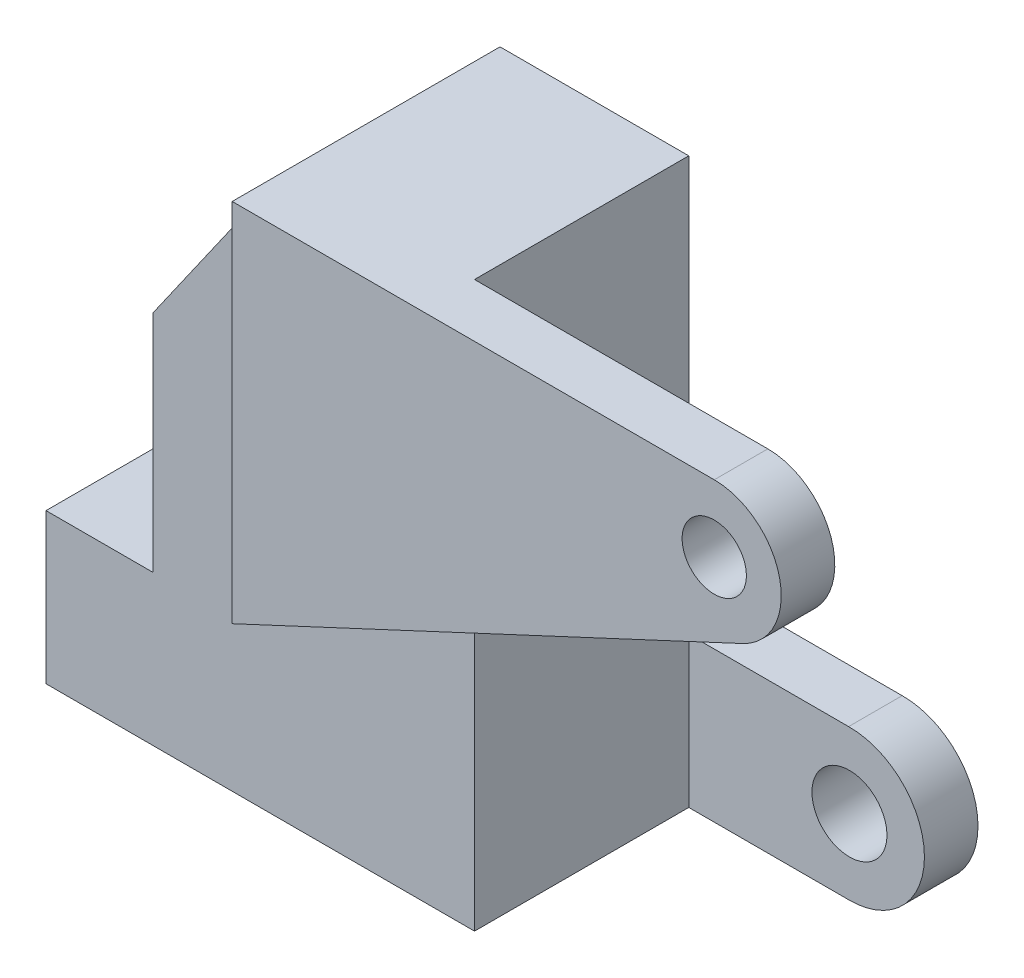
ISO-10303-21;
HEADER;
FILE_DESCRIPTION(('STEP AP214'),'2;1');
FILE_NAME('part.step','',(''),(''),'','','');
FILE_SCHEMA(('AUTOMOTIVE_DESIGN { 1 0 10303 214 1 1 1 1 }'));
ENDSEC;
DATA;
#1=APPLICATION_CONTEXT('core data for automotive mechanical design processes');
#2=APPLICATION_PROTOCOL_DEFINITION('international standard','automotive_design',2000,#1);
#3=PRODUCT_CONTEXT('',#1,'mechanical');
#4=PRODUCT('Part','Part','',(#3));
#5=PRODUCT_RELATED_PRODUCT_CATEGORY('part','',(#4));
#6=PRODUCT_DEFINITION_FORMATION('','',#4);
#7=PRODUCT_DEFINITION_CONTEXT('part definition',#1,'design');
#8=PRODUCT_DEFINITION('design','',#6,#7);
#9=PRODUCT_DEFINITION_SHAPE('','',#8);
#10=(LENGTH_UNIT() NAMED_UNIT(*) SI_UNIT(.MILLI.,.METRE.));
#11=(NAMED_UNIT(*) PLANE_ANGLE_UNIT() SI_UNIT($,.RADIAN.));
#12=(NAMED_UNIT(*) SI_UNIT($,.STERADIAN.) SOLID_ANGLE_UNIT());
#13=UNCERTAINTY_MEASURE_WITH_UNIT(LENGTH_MEASURE(1.E-05),#10,'distance_accuracy_value','');
#14=(GEOMETRIC_REPRESENTATION_CONTEXT(3) GLOBAL_UNCERTAINTY_ASSIGNED_CONTEXT((#13)) GLOBAL_UNIT_ASSIGNED_CONTEXT((#10,
#11,#12)) REPRESENTATION_CONTEXT('',''));
#15=CARTESIAN_POINT('',(0.,0.,0.));
#16=DIRECTION('',(0.,0.,1.));
#17=DIRECTION('',(1.,0.,0.));
#18=AXIS2_PLACEMENT_3D('',#15,#16,#17);
#19=CARTESIAN_POINT('',(0.,0.,0.));
#20=DIRECTION('',(0.,0.,1.));
#21=DIRECTION('',(1.,0.,0.));
#22=AXIS2_PLACEMENT_3D('',#19,#20,#21);
#23=PLANE('',#22);
#24=DIRECTION('',(1.,0.,0.));
#25=VECTOR('',#24,1.);
#26=CARTESIAN_POINT('',(54.9222940345143,14.,0.));
#27=LINE('',#26,#25);
#28=CARTESIAN_POINT('',(10.,14.,0.));
#29=VERTEX_POINT('',#28);
#30=CARTESIAN_POINT('',(40.,14.,0.));
#31=VERTEX_POINT('',#30);
#32=EDGE_CURVE('E218',#29,#31,#27,.T.);
#33=ORIENTED_EDGE('',*,*,#32,.F.);
#34=DIRECTION('',(0.,-1.,0.));
#35=VECTOR('',#34,1.);
#36=CARTESIAN_POINT('',(10.,35.,0.));
#37=LINE('',#36,#35);
#38=CARTESIAN_POINT('',(10.,35.,0.));
#39=VERTEX_POINT('',#38);
#40=EDGE_CURVE('E285',#39,#29,#37,.T.);
#41=ORIENTED_EDGE('',*,*,#40,.F.);
#42=DIRECTION('',(-0.573576436351047,-0.819152044288991,0.));
#43=VECTOR('',#42,1.);
#44=CARTESIAN_POINT('',(22.3806500179262,52.681400645273,0.));
#45=LINE('',#44,#43);
#46=CARTESIAN_POINT('',(22.3806500179262,52.681400645273,0.));
#47=VERTEX_POINT('',#46);
#48=EDGE_CURVE('E282',#47,#39,#45,.T.);
#49=ORIENTED_EDGE('',*,*,#48,.F.);
#50=DIRECTION('',(-1.,0.,0.));
#51=VECTOR('',#50,1.);
#52=CARTESIAN_POINT('',(40.,52.681400645273,0.));
#53=LINE('',#52,#51);
#54=CARTESIAN_POINT('',(40.,52.681400645273,0.));
#55=VERTEX_POINT('',#54);
#56=EDGE_CURVE('E278',#55,#47,#53,.T.);
#57=ORIENTED_EDGE('',*,*,#56,.F.);
#58=DIRECTION('',(0.,1.,0.));
#59=VECTOR('',#58,1.);
#60=CARTESIAN_POINT('',(40.,0.,0.));
#61=LINE('',#60,#59);
#62=EDGE_CURVE('E69',#31,#55,#61,.T.);
#63=ORIENTED_EDGE('',*,*,#62,.F.);
#64=EDGE_LOOP('',(#33,#41,#49,#57,#63));
#65=FACE_BOUND('',#64,.T.);
#66=ADVANCED_FACE('F43',(#65),#23,.F.);
#67=DIRECTION('',(0.,1.,0.));
#68=VECTOR('',#67,1.);
#69=CARTESIAN_POINT('',(10.,0.,0.));
#70=LINE('',#69,#68);
#71=CARTESIAN_POINT('',(10.,0.,0.));
#72=VERTEX_POINT('',#71);
#73=EDGE_CURVE('E208',#72,#29,#70,.T.);
#74=ORIENTED_EDGE('',*,*,#73,.F.);
#75=DIRECTION('',(1.,0.,0.));
#76=VECTOR('',#75,1.);
#77=CARTESIAN_POINT('',(0.,0.,0.));
#78=LINE('',#77,#76);
#79=CARTESIAN_POINT('',(0.,0.,0.));
#80=VERTEX_POINT('',#79);
#81=EDGE_CURVE('E271',#80,#72,#78,.T.);
#82=ORIENTED_EDGE('',*,*,#81,.F.);
#83=DIRECTION('',(0.,-1.,0.));
#84=VECTOR('',#83,1.);
#85=CARTESIAN_POINT('',(0.,14.,0.));
#86=LINE('',#85,#84);
#87=CARTESIAN_POINT('',(0.,14.,0.));
#88=VERTEX_POINT('',#87);
#89=EDGE_CURVE('E245',#88,#80,#86,.T.);
#90=ORIENTED_EDGE('',*,*,#89,.F.);
#91=DIRECTION('',(-1.,0.,0.));
#92=VECTOR('',#91,1.);
#93=CARTESIAN_POINT('',(10.,14.,0.));
#94=LINE('',#93,#92);
#95=EDGE_CURVE('E251',#29,#88,#94,.T.);
#96=ORIENTED_EDGE('',*,*,#95,.F.);
#97=EDGE_LOOP('',(#74,#82,#90,#96));
#98=FACE_BOUND('',#97,.T.);
#99=ADVANCED_FACE('F325',(#98),#23,.F.);
#100=DIRECTION('',(-0.999999999815628,-1.92026949065218E-05,0.));
#101=VECTOR('',#100,1.);
#102=CARTESIAN_POINT('',(54.9222940262319,0.00086262910684584,0.));
#103=LINE('',#102,#101);
#104=CARTESIAN_POINT('',(40.,0.000576080847301866,0.));
#105=VERTEX_POINT('',#104);
#106=EDGE_CURVE('E11',#105,#72,#103,.T.);
#107=ORIENTED_EDGE('',*,*,#106,.F.);
#108=CARTESIAN_POINT('',(40.,0.,0.));
#109=VERTEX_POINT('',#108);
#110=EDGE_CURVE('E274',#109,#105,#61,.T.);
#111=ORIENTED_EDGE('',*,*,#110,.F.);
#112=EDGE_CURVE('E270',#72,#109,#78,.T.);
#113=ORIENTED_EDGE('',*,*,#112,.F.);
#114=EDGE_LOOP('',(#107,#111,#113));
#115=FACE_BOUND('',#114,.T.);
#116=ADVANCED_FACE('F424',(#115),#23,.F.);
#117=CARTESIAN_POINT('',(0.,14.,20.));
#118=DIRECTION('',(1.,0.,0.));
#119=DIRECTION('',(0.,1.,0.));
#120=AXIS2_PLACEMENT_3D('',#117,#118,#119);
#121=PLANE('',#120);
#122=ORIENTED_EDGE('',*,*,#89,.T.);
#123=DIRECTION('',(0.,0.,-1.));
#124=VECTOR('',#123,1.);
#125=CARTESIAN_POINT('',(0.,0.,20.));
#126=LINE('',#125,#124);
#127=CARTESIAN_POINT('',(0.,0.,20.));
#128=VERTEX_POINT('',#127);
#129=EDGE_CURVE('E47',#128,#80,#126,.T.);
#130=ORIENTED_EDGE('',*,*,#129,.F.);
#131=DIRECTION('',(0.,-1.,0.));
#132=VECTOR('',#131,1.);
#133=CARTESIAN_POINT('',(0.,14.,20.));
#134=LINE('',#133,#132);
#135=CARTESIAN_POINT('',(0.,14.,20.));
#136=VERTEX_POINT('',#135);
#137=EDGE_CURVE('E246',#136,#128,#134,.T.);
#138=ORIENTED_EDGE('',*,*,#137,.F.);
#139=DIRECTION('',(0.,0.,-1.));
#140=VECTOR('',#139,1.);
#141=CARTESIAN_POINT('',(0.,14.,20.));
#142=LINE('',#141,#140);
#143=EDGE_CURVE('E266',#136,#88,#142,.T.);
#144=ORIENTED_EDGE('',*,*,#143,.T.);
#145=EDGE_LOOP('',(#122,#130,#138,#144));
#146=FACE_BOUND('',#145,.T.);
#147=ADVANCED_FACE('F45',(#146),#121,.F.);
#148=CARTESIAN_POINT('',(0.,0.,20.));
#149=DIRECTION('',(0.,1.,0.));
#150=DIRECTION('',(0.,0.,1.));
#151=AXIS2_PLACEMENT_3D('',#148,#149,#150);
#152=PLANE('',#151);
#153=ORIENTED_EDGE('',*,*,#81,.T.);
#154=ORIENTED_EDGE('',*,*,#112,.T.);
#155=DIRECTION('',(0.,0.,-1.));
#156=VECTOR('',#155,1.);
#157=CARTESIAN_POINT('',(40.,0.,20.));
#158=LINE('',#157,#156);
#159=CARTESIAN_POINT('',(40.,0.,20.));
#160=VERTEX_POINT('',#159);
#161=EDGE_CURVE('E307',#160,#109,#158,.T.);
#162=ORIENTED_EDGE('',*,*,#161,.F.);
#163=DIRECTION('',(1.,0.,0.));
#164=VECTOR('',#163,1.);
#165=CARTESIAN_POINT('',(0.,0.,20.));
#166=LINE('',#165,#164);
#167=EDGE_CURVE('E250',#128,#160,#166,.T.);
#168=ORIENTED_EDGE('',*,*,#167,.F.);
#169=ORIENTED_EDGE('',*,*,#129,.T.);
#170=EDGE_LOOP('',(#153,#154,#162,#168,#169));
#171=FACE_BOUND('',#170,.T.);
#172=ADVANCED_FACE('F316',(#171),#152,.F.);
#173=CARTESIAN_POINT('',(40.,0.,20.));
#174=DIRECTION('',(-1.,0.,0.));
#175=DIRECTION('',(0.,0.,1.));
#176=AXIS2_PLACEMENT_3D('',#173,#174,#175);
#177=PLANE('',#176);
#178=ORIENTED_EDGE('',*,*,#110,.T.);
#179=EDGE_CURVE('E279',#105,#31,#61,.T.);
#180=ORIENTED_EDGE('',*,*,#179,.T.);
#181=ORIENTED_EDGE('',*,*,#62,.T.);
#182=DIRECTION('',(0.,0.,-1.));
#183=VECTOR('',#182,1.);
#184=CARTESIAN_POINT('',(40.,52.681400645273,20.));
#185=LINE('',#184,#183);
#186=CARTESIAN_POINT('',(40.,52.681400645273,20.));
#187=VERTEX_POINT('',#186);
#188=EDGE_CURVE('E304',#187,#55,#185,.T.);
#189=ORIENTED_EDGE('',*,*,#188,.F.);
#190=DIRECTION('',(0.,1.,0.));
#191=VECTOR('',#190,1.);
#192=CARTESIAN_POINT('',(40.,0.,20.));
#193=LINE('',#192,#191);
#194=CARTESIAN_POINT('',(40.,26.7629500636468,20.));
#195=VERTEX_POINT('',#194);
#196=EDGE_CURVE('E61',#195,#187,#193,.T.);
#197=ORIENTED_EDGE('',*,*,#196,.F.);
#198=EDGE_CURVE('E254',#160,#195,#193,.T.);
#199=ORIENTED_EDGE('',*,*,#198,.F.);
#200=ORIENTED_EDGE('',*,*,#161,.T.);
#201=EDGE_LOOP('',(#178,#180,#181,#189,#197,#199,#200));
#202=FACE_BOUND('',#201,.T.);
#203=ADVANCED_FACE('F351',(#202),#177,.F.);
#204=CARTESIAN_POINT('',(40.,52.681400645273,20.));
#205=DIRECTION('',(0.,-1.,0.));
#206=DIRECTION('',(1.,0.,0.));
#207=AXIS2_PLACEMENT_3D('',#204,#205,#206);
#208=PLANE('',#207);
#209=ORIENTED_EDGE('',*,*,#56,.T.);
#210=DIRECTION('',(0.,0.,-1.));
#211=VECTOR('',#210,1.);
#212=CARTESIAN_POINT('',(22.3806500179262,52.681400645273,20.));
#213=LINE('',#212,#211);
#214=CARTESIAN_POINT('',(22.3806500179262,52.681400645273,20.));
#215=VERTEX_POINT('',#214);
#216=EDGE_CURVE('E185',#215,#47,#213,.T.);
#217=ORIENTED_EDGE('',*,*,#216,.F.);
#218=DIRECTION('',(0.,0.,-1.));
#219=VECTOR('',#218,1.);
#220=CARTESIAN_POINT('',(22.3806500179262,52.681400645273,25.));
#221=LINE('',#220,#219);
#222=CARTESIAN_POINT('',(22.3806500179262,52.681400645273,25.));
#223=VERTEX_POINT('',#222);
#224=EDGE_CURVE('E162',#223,#215,#221,.T.);
#225=ORIENTED_EDGE('',*,*,#224,.F.);
#226=DIRECTION('',(-1.,0.,0.));
#227=VECTOR('',#226,1.);
#228=CARTESIAN_POINT('',(67.3806500179262,52.681400645273,25.));
#229=LINE('',#228,#227);
#230=CARTESIAN_POINT('',(67.3806500179262,52.681400645273,25.));
#231=VERTEX_POINT('',#230);
#232=EDGE_CURVE('E169',#231,#223,#229,.T.);
#233=ORIENTED_EDGE('',*,*,#232,.F.);
#234=DIRECTION('',(0.,0.,-1.));
#235=VECTOR('',#234,1.);
#236=CARTESIAN_POINT('',(67.3806500179262,52.681400645273,25.));
#237=LINE('',#236,#235);
#238=CARTESIAN_POINT('',(67.3806500179262,52.681400645273,20.));
#239=VERTEX_POINT('',#238);
#240=EDGE_CURVE('E383',#231,#239,#237,.T.);
#241=ORIENTED_EDGE('',*,*,#240,.T.);
#242=DIRECTION('',(-1.,0.,0.));
#243=VECTOR('',#242,1.);
#244=CARTESIAN_POINT('',(67.3806500179262,52.681400645273,20.));
#245=LINE('',#244,#243);
#246=EDGE_CURVE('E354',#239,#187,#245,.T.);
#247=ORIENTED_EDGE('',*,*,#246,.T.);
#248=ORIENTED_EDGE('',*,*,#188,.T.);
#249=EDGE_LOOP('',(#209,#217,#225,#233,#241,#247,#248));
#250=FACE_BOUND('',#249,.T.);
#251=ADVANCED_FACE('F183',(#250),#208,.F.);
#252=CARTESIAN_POINT('',(22.3806500179262,52.681400645273,20.));
#253=DIRECTION('',(0.819152044288991,-0.573576436351047,0.));
#254=DIRECTION('',(0.573576436351047,0.819152044288991,0.));
#255=AXIS2_PLACEMENT_3D('',#252,#253,#254);
#256=PLANE('',#255);
#257=ORIENTED_EDGE('',*,*,#48,.T.);
#258=DIRECTION('',(0.,0.,-1.));
#259=VECTOR('',#258,1.);
#260=CARTESIAN_POINT('',(10.,35.,20.));
#261=LINE('',#260,#259);
#262=CARTESIAN_POINT('',(10.,35.,20.));
#263=VERTEX_POINT('',#262);
#264=EDGE_CURVE('E298',#263,#39,#261,.T.);
#265=ORIENTED_EDGE('',*,*,#264,.F.);
#266=DIRECTION('',(-0.573576436351047,-0.819152044288991,0.));
#267=VECTOR('',#266,1.);
#268=CARTESIAN_POINT('',(22.3806500179262,52.681400645273,20.));
#269=LINE('',#268,#267);
#270=EDGE_CURVE('E257',#215,#263,#269,.T.);
#271=ORIENTED_EDGE('',*,*,#270,.F.);
#272=ORIENTED_EDGE('',*,*,#216,.T.);
#273=EDGE_LOOP('',(#257,#265,#271,#272));
#274=FACE_BOUND('',#273,.T.);
#275=ADVANCED_FACE('F359',(#274),#256,.F.);
#276=CARTESIAN_POINT('',(10.,35.,20.));
#277=DIRECTION('',(1.,0.,0.));
#278=DIRECTION('',(0.,1.,0.));
#279=AXIS2_PLACEMENT_3D('',#276,#277,#278);
#280=PLANE('',#279);
#281=ORIENTED_EDGE('',*,*,#40,.T.);
#282=DIRECTION('',(0.,0.,-1.));
#283=VECTOR('',#282,1.);
#284=CARTESIAN_POINT('',(10.,14.,20.));
#285=LINE('',#284,#283);
#286=CARTESIAN_POINT('',(10.,14.,20.));
#287=VERTEX_POINT('',#286);
#288=EDGE_CURVE('E294',#287,#29,#285,.T.);
#289=ORIENTED_EDGE('',*,*,#288,.F.);
#290=DIRECTION('',(0.,-1.,0.));
#291=VECTOR('',#290,1.);
#292=CARTESIAN_POINT('',(10.,35.,20.));
#293=LINE('',#292,#291);
#294=EDGE_CURVE('E260',#263,#287,#293,.T.);
#295=ORIENTED_EDGE('',*,*,#294,.F.);
#296=ORIENTED_EDGE('',*,*,#264,.T.);
#297=EDGE_LOOP('',(#281,#289,#295,#296));
#298=FACE_BOUND('',#297,.T.);
#299=ADVANCED_FACE('F362',(#298),#280,.F.);
#300=CARTESIAN_POINT('',(10.,14.,20.));
#301=DIRECTION('',(0.,-1.,0.));
#302=DIRECTION('',(1.,0.,0.));
#303=AXIS2_PLACEMENT_3D('',#300,#301,#302);
#304=PLANE('',#303);
#305=ORIENTED_EDGE('',*,*,#95,.T.);
#306=ORIENTED_EDGE('',*,*,#143,.F.);
#307=DIRECTION('',(-1.,0.,0.));
#308=VECTOR('',#307,1.);
#309=CARTESIAN_POINT('',(10.,14.,20.));
#310=LINE('',#309,#308);
#311=EDGE_CURVE('E263',#287,#136,#310,.T.);
#312=ORIENTED_EDGE('',*,*,#311,.F.);
#313=ORIENTED_EDGE('',*,*,#288,.T.);
#314=EDGE_LOOP('',(#305,#306,#312,#313));
#315=FACE_BOUND('',#314,.T.);
#316=ADVANCED_FACE('F447',(#315),#304,.F.);
#317=CARTESIAN_POINT('',(0.,0.,20.));
#318=DIRECTION('',(0.,0.,1.));
#319=DIRECTION('',(1.,0.,0.));
#320=AXIS2_PLACEMENT_3D('',#317,#318,#319);
#321=PLANE('',#320);
#322=DIRECTION('',(0.906307787036648,0.422618261740704,0.));
#323=VECTOR('',#322,1.);
#324=CARTESIAN_POINT('',(22.3806500179262,18.5469122352926,20.));
#325=LINE('',#324,#323);
#326=CARTESIAN_POINT('',(22.3806500179262,18.5469122352926,20.));
#327=VERTEX_POINT('',#326);
#328=EDGE_CURVE('E369',#327,#195,#325,.T.);
#329=ORIENTED_EDGE('',*,*,#328,.F.);
#330=DIRECTION('',(0.,-1.,0.));
#331=VECTOR('',#330,1.);
#332=CARTESIAN_POINT('',(22.3806500179262,52.681400645273,20.));
#333=LINE('',#332,#331);
#334=EDGE_CURVE('E367',#215,#327,#333,.T.);
#335=ORIENTED_EDGE('',*,*,#334,.F.);
#336=ORIENTED_EDGE('',*,*,#270,.T.);
#337=ORIENTED_EDGE('',*,*,#294,.T.);
#338=ORIENTED_EDGE('',*,*,#311,.T.);
#339=ORIENTED_EDGE('',*,*,#137,.T.);
#340=ORIENTED_EDGE('',*,*,#167,.T.);
#341=ORIENTED_EDGE('',*,*,#198,.T.);
#342=EDGE_LOOP('',(#329,#335,#336,#337,#338,#339,#340,#341));
#343=FACE_BOUND('',#342,.T.);
#344=ADVANCED_FACE('F366',(#343),#321,.T.);
#345=CARTESIAN_POINT('',(55.,7.00043131450745,-5.));
#346=DIRECTION('',(0.,0.,-1.));
#347=DIRECTION('',(-1.,0.,0.));
#348=AXIS2_PLACEMENT_3D('',#345,#346,#347);
#349=PLANE('',#348);
#350=DIRECTION('',(1.,0.,0.));
#351=VECTOR('',#350,1.);
#352=CARTESIAN_POINT('',(54.9222940345143,14.,-5.));
#353=LINE('',#352,#351);
#354=CARTESIAN_POINT('',(10.,14.,-5.));
#355=VERTEX_POINT('',#354);
#356=CARTESIAN_POINT('',(54.9222940345143,14.,-5.));
#357=VERTEX_POINT('',#356);
#358=EDGE_CURVE('E203',#355,#357,#353,.T.);
#359=ORIENTED_EDGE('',*,*,#358,.T.);
#360=CARTESIAN_POINT('',(55.,7.00043131450745,-5.));
#361=DIRECTION('',(0.,0.,-1.));
#362=DIRECTION('',(-1.,0.,0.));
#363=AXIS2_PLACEMENT_3D('',#360,#361,#362);
#364=CIRCLE('',#363,7.);
#365=CARTESIAN_POINT('',(54.9222940262319,0.00086262910684584,-5.));
#366=VERTEX_POINT('',#365);
#367=EDGE_CURVE('E207',#357,#366,#364,.T.);
#368=ORIENTED_EDGE('',*,*,#367,.T.);
#369=DIRECTION('',(-0.999999999815628,-1.92026949065218E-05,0.));
#370=VECTOR('',#369,1.);
#371=CARTESIAN_POINT('',(54.9222940262319,0.00086262910684584,-5.));
#372=LINE('',#371,#370);
#373=CARTESIAN_POINT('',(10.,0.,-5.));
#374=VERTEX_POINT('',#373);
#375=EDGE_CURVE('E211',#366,#374,#372,.T.);
#376=ORIENTED_EDGE('',*,*,#375,.T.);
#377=DIRECTION('',(0.,1.,0.));
#378=VECTOR('',#377,1.);
#379=CARTESIAN_POINT('',(10.,0.,-5.));
#380=LINE('',#379,#378);
#381=EDGE_CURVE('E214',#374,#355,#380,.T.);
#382=ORIENTED_EDGE('',*,*,#381,.T.);
#383=EDGE_LOOP('',(#359,#368,#376,#382));
#384=FACE_BOUND('',#383,.T.);
#385=CARTESIAN_POINT('',(55.,7.00043131450745,-5.));
#386=DIRECTION('',(0.,0.,-1.));
#387=DIRECTION('',(-1.,0.,0.));
#388=AXIS2_PLACEMENT_3D('',#385,#386,#387);
#389=CIRCLE('',#388,3.5);
#390=CARTESIAN_POINT('',(51.5,7.00043131450745,-5.));
#391=VERTEX_POINT('',#390);
#392=EDGE_CURVE('E193',#391,#391,#389,.T.);
#393=ORIENTED_EDGE('',*,*,#392,.F.);
#394=EDGE_LOOP('',(#393));
#395=FACE_BOUND('',#394,.T.);
#396=ADVANCED_FACE('F338',(#384,#395),#349,.T.);
#397=CARTESIAN_POINT('',(55.,7.00043131450745,0.));
#398=DIRECTION('',(0.,0.,-1.));
#399=DIRECTION('',(-1.,0.,0.));
#400=AXIS2_PLACEMENT_3D('',#397,#398,#399);
#401=PLANE('',#400);
#402=ORIENTED_EDGE('',*,*,#179,.F.);
#403=CARTESIAN_POINT('',(54.9222940262319,0.00086262910684584,0.));
#404=VERTEX_POINT('',#403);
#405=EDGE_CURVE('E54',#404,#105,#103,.T.);
#406=ORIENTED_EDGE('',*,*,#405,.F.);
#407=CARTESIAN_POINT('',(55.,7.00043131450745,0.));
#408=DIRECTION('',(0.,0.,-1.));
#409=DIRECTION('',(-1.,0.,0.));
#410=AXIS2_PLACEMENT_3D('',#407,#408,#409);
#411=CIRCLE('',#410,7.);
#412=CARTESIAN_POINT('',(54.9222940345143,14.,0.));
#413=VERTEX_POINT('',#412);
#414=EDGE_CURVE('E222',#413,#404,#411,.T.);
#415=ORIENTED_EDGE('',*,*,#414,.F.);
#416=EDGE_CURVE('E201',#31,#413,#27,.T.);
#417=ORIENTED_EDGE('',*,*,#416,.F.);
#418=EDGE_LOOP('',(#402,#406,#415,#417));
#419=FACE_BOUND('',#418,.T.);
#420=CARTESIAN_POINT('',(55.,7.00043131450745,0.));
#421=DIRECTION('',(0.,0.,-1.));
#422=DIRECTION('',(-1.,0.,0.));
#423=AXIS2_PLACEMENT_3D('',#420,#421,#422);
#424=CIRCLE('',#423,3.5);
#425=CARTESIAN_POINT('',(51.5,7.00043131450745,0.));
#426=VERTEX_POINT('',#425);
#427=EDGE_CURVE('E188',#426,#426,#424,.T.);
#428=ORIENTED_EDGE('',*,*,#427,.T.);
#429=EDGE_LOOP('',(#428));
#430=FACE_BOUND('',#429,.T.);
#431=ADVANCED_FACE('F346',(#419,#430),#401,.F.);
#432=CARTESIAN_POINT('',(54.9222940345143,14.,-5.));
#433=DIRECTION('',(0.,-1.,0.));
#434=DIRECTION('',(0.,0.,-1.));
#435=AXIS2_PLACEMENT_3D('',#432,#433,#434);
#436=PLANE('',#435);
#437=ORIENTED_EDGE('',*,*,#32,.T.);
#438=ORIENTED_EDGE('',*,*,#416,.T.);
#439=DIRECTION('',(0.,0.,1.));
#440=VECTOR('',#439,1.);
#441=CARTESIAN_POINT('',(54.9222940345143,14.,-5.));
#442=LINE('',#441,#440);
#443=EDGE_CURVE('E241',#357,#413,#442,.T.);
#444=ORIENTED_EDGE('',*,*,#443,.F.);
#445=ORIENTED_EDGE('',*,*,#358,.F.);
#446=DIRECTION('',(0.,0.,1.));
#447=VECTOR('',#446,1.);
#448=CARTESIAN_POINT('',(10.,14.,-5.));
#449=LINE('',#448,#447);
#450=EDGE_CURVE('E217',#355,#29,#449,.T.);
#451=ORIENTED_EDGE('',*,*,#450,.T.);
#452=EDGE_LOOP('',(#437,#438,#444,#445,#451));
#453=FACE_BOUND('',#452,.T.);
#454=ADVANCED_FACE('F456',(#453),#436,.F.);
#455=CARTESIAN_POINT('',(55.,7.00043131450745,-5.));
#456=DIRECTION('',(0.,0.,1.));
#457=DIRECTION('',(1.,0.,0.));
#458=AXIS2_PLACEMENT_3D('',#455,#456,#457);
#459=CYLINDRICAL_SURFACE('',#458,7.);
#460=ORIENTED_EDGE('',*,*,#414,.T.);
#461=DIRECTION('',(0.,0.,1.));
#462=VECTOR('',#461,1.);
#463=CARTESIAN_POINT('',(54.9222940262319,0.00086262910684584,-5.));
#464=LINE('',#463,#462);
#465=EDGE_CURVE('E237',#366,#404,#464,.T.);
#466=ORIENTED_EDGE('',*,*,#465,.F.);
#467=ORIENTED_EDGE('',*,*,#367,.F.);
#468=ORIENTED_EDGE('',*,*,#443,.T.);
#469=EDGE_LOOP('',(#460,#466,#467,#468));
#470=FACE_BOUND('',#469,.T.);
#471=ADVANCED_FACE('F457',(#470),#459,.T.);
#472=CARTESIAN_POINT('',(54.9222940262319,0.00086262910684584,-5.));
#473=DIRECTION('',(-1.92026949065218E-05,0.999999999815628,0.));
#474=DIRECTION('',(-0.999999999815628,-1.92026949065218E-05,0.));
#475=AXIS2_PLACEMENT_3D('',#472,#473,#474);
#476=PLANE('',#475);
#477=ORIENTED_EDGE('',*,*,#405,.T.);
#478=ORIENTED_EDGE('',*,*,#106,.T.);
#479=DIRECTION('',(0.,0.,1.));
#480=VECTOR('',#479,1.);
#481=CARTESIAN_POINT('',(10.,0.,-5.));
#482=LINE('',#481,#480);
#483=EDGE_CURVE('E233',#374,#72,#482,.T.);
#484=ORIENTED_EDGE('',*,*,#483,.F.);
#485=ORIENTED_EDGE('',*,*,#375,.F.);
#486=ORIENTED_EDGE('',*,*,#465,.T.);
#487=EDGE_LOOP('',(#477,#478,#484,#485,#486));
#488=FACE_BOUND('',#487,.T.);
#489=ADVANCED_FACE('F330',(#488),#476,.F.);
#490=CARTESIAN_POINT('',(10.,0.,-5.));
#491=DIRECTION('',(1.,0.,0.));
#492=DIRECTION('',(0.,0.,-1.));
#493=AXIS2_PLACEMENT_3D('',#490,#491,#492);
#494=PLANE('',#493);
#495=ORIENTED_EDGE('',*,*,#73,.T.);
#496=ORIENTED_EDGE('',*,*,#450,.F.);
#497=ORIENTED_EDGE('',*,*,#381,.F.);
#498=ORIENTED_EDGE('',*,*,#483,.T.);
#499=EDGE_LOOP('',(#495,#496,#497,#498));
#500=FACE_BOUND('',#499,.T.);
#501=ADVANCED_FACE('F335',(#500),#494,.F.);
#502=CARTESIAN_POINT('',(55.,7.00043131450745,-5.));
#503=DIRECTION('',(0.,0.,1.));
#504=DIRECTION('',(1.,0.,0.));
#505=AXIS2_PLACEMENT_3D('',#502,#503,#504);
#506=CYLINDRICAL_SURFACE('',#505,3.5);
#507=ORIENTED_EDGE('',*,*,#392,.T.);
#508=EDGE_LOOP('',(#507));
#509=FACE_BOUND('',#508,.T.);
#510=ORIENTED_EDGE('',*,*,#427,.F.);
#511=EDGE_LOOP('',(#510));
#512=FACE_BOUND('',#511,.T.);
#513=ADVANCED_FACE('F418',(#509,#512),#506,.F.);
#514=CARTESIAN_POINT('',(67.3806500179262,46.4292461111549,20.));
#515=DIRECTION('',(0.,0.,1.));
#516=DIRECTION('',(1.,0.,0.));
#517=AXIS2_PLACEMENT_3D('',#514,#515,#516);
#518=PLANE('',#517);
#519=CARTESIAN_POINT('',(67.3806500179262,46.4292461111549,20.));
#520=DIRECTION('',(0.,0.,1.));
#521=DIRECTION('',(1.,0.,0.));
#522=AXIS2_PLACEMENT_3D('',#519,#520,#521);
#523=CIRCLE('',#522,3.00000000000001);
#524=CARTESIAN_POINT('',(70.3806500179262,46.4292461111549,20.));
#525=VERTEX_POINT('',#524);
#526=EDGE_CURVE('E401',#525,#525,#523,.T.);
#527=ORIENTED_EDGE('',*,*,#526,.T.);
#528=EDGE_LOOP('',(#527));
#529=FACE_BOUND('',#528,.T.);
#530=CARTESIAN_POINT('',(70.0229246992694,40.7628697711272,20.));
#531=VERTEX_POINT('',#530);
#532=EDGE_CURVE('E371',#195,#531,#325,.T.);
#533=ORIENTED_EDGE('',*,*,#532,.F.);
#534=ORIENTED_EDGE('',*,*,#196,.T.);
#535=ORIENTED_EDGE('',*,*,#246,.F.);
#536=CARTESIAN_POINT('',(67.3806500179262,46.4292461111549,20.));
#537=DIRECTION('',(0.,0.,1.));
#538=DIRECTION('',(1.,0.,0.));
#539=AXIS2_PLACEMENT_3D('',#536,#537,#538);
#540=CIRCLE('',#539,6.25215453411808);
#541=EDGE_CURVE('E180',#531,#239,#540,.T.);
#542=ORIENTED_EDGE('',*,*,#541,.F.);
#543=EDGE_LOOP('',(#533,#534,#535,#542));
#544=FACE_BOUND('',#543,.T.);
#545=ADVANCED_FACE('F394',(#529,#544),#518,.F.);
#546=CARTESIAN_POINT('',(67.3806500179262,46.4292461111549,25.));
#547=DIRECTION('',(0.,0.,1.));
#548=DIRECTION('',(1.,0.,0.));
#549=AXIS2_PLACEMENT_3D('',#546,#547,#548);
#550=PLANE('',#549);
#551=ORIENTED_EDGE('',*,*,#232,.T.);
#552=DIRECTION('',(0.,-1.,0.));
#553=VECTOR('',#552,1.);
#554=CARTESIAN_POINT('',(22.3806500179262,52.681400645273,25.));
#555=LINE('',#554,#553);
#556=CARTESIAN_POINT('',(22.3806500179262,18.5469122352926,25.));
#557=VERTEX_POINT('',#556);
#558=EDGE_CURVE('E157',#223,#557,#555,.T.);
#559=ORIENTED_EDGE('',*,*,#558,.T.);
#560=DIRECTION('',(0.906307787036648,0.422618261740704,0.));
#561=VECTOR('',#560,1.);
#562=CARTESIAN_POINT('',(22.3806500179262,18.5469122352926,25.));
#563=LINE('',#562,#561);
#564=CARTESIAN_POINT('',(70.0229246992694,40.7628697711272,25.));
#565=VERTEX_POINT('',#564);
#566=EDGE_CURVE('E168',#557,#565,#563,.T.);
#567=ORIENTED_EDGE('',*,*,#566,.T.);
#568=CARTESIAN_POINT('',(67.3806500179262,46.4292461111549,25.));
#569=DIRECTION('',(0.,0.,1.));
#570=DIRECTION('',(1.,0.,0.));
#571=AXIS2_PLACEMENT_3D('',#568,#569,#570);
#572=CIRCLE('',#571,6.25215453411808);
#573=EDGE_CURVE('E175',#565,#231,#572,.T.);
#574=ORIENTED_EDGE('',*,*,#573,.T.);
#575=EDGE_LOOP('',(#551,#559,#567,#574));
#576=FACE_BOUND('',#575,.T.);
#577=CARTESIAN_POINT('',(67.3806500179262,46.4292461111549,25.));
#578=DIRECTION('',(0.,0.,1.));
#579=DIRECTION('',(1.,0.,0.));
#580=AXIS2_PLACEMENT_3D('',#577,#578,#579);
#581=CIRCLE('',#580,3.00000000000001);
#582=CARTESIAN_POINT('',(70.3806500179262,46.4292461111549,25.));
#583=VERTEX_POINT('',#582);
#584=EDGE_CURVE('E376',#583,#583,#581,.T.);
#585=ORIENTED_EDGE('',*,*,#584,.F.);
#586=EDGE_LOOP('',(#585));
#587=FACE_BOUND('',#586,.T.);
#588=ADVANCED_FACE('F172',(#576,#587),#550,.T.);
#589=CARTESIAN_POINT('',(22.3806500179262,52.681400645273,25.));
#590=DIRECTION('',(1.,0.,0.));
#591=DIRECTION('',(0.,1.,0.));
#592=AXIS2_PLACEMENT_3D('',#589,#590,#591);
#593=PLANE('',#592);
#594=ORIENTED_EDGE('',*,*,#334,.T.);
#595=DIRECTION('',(0.,0.,-1.));
#596=VECTOR('',#595,1.);
#597=CARTESIAN_POINT('',(22.3806500179262,18.5469122352926,25.));
#598=LINE('',#597,#596);
#599=EDGE_CURVE('E164',#557,#327,#598,.T.);
#600=ORIENTED_EDGE('',*,*,#599,.F.);
#601=ORIENTED_EDGE('',*,*,#558,.F.);
#602=ORIENTED_EDGE('',*,*,#224,.T.);
#603=EDGE_LOOP('',(#594,#600,#601,#602));
#604=FACE_BOUND('',#603,.T.);
#605=ADVANCED_FACE('F160',(#604),#593,.F.);
#606=CARTESIAN_POINT('',(22.3806500179262,18.5469122352926,25.));
#607=DIRECTION('',(-0.422618261740704,0.906307787036648,0.));
#608=DIRECTION('',(-0.906307787036648,-0.422618261740704,0.));
#609=AXIS2_PLACEMENT_3D('',#606,#607,#608);
#610=PLANE('',#609);
#611=ORIENTED_EDGE('',*,*,#328,.T.);
#612=ORIENTED_EDGE('',*,*,#532,.T.);
#613=DIRECTION('',(0.,0.,-1.));
#614=VECTOR('',#613,1.);
#615=CARTESIAN_POINT('',(70.0229246992694,40.7628697711272,25.));
#616=LINE('',#615,#614);
#617=EDGE_CURVE('E195',#565,#531,#616,.T.);
#618=ORIENTED_EDGE('',*,*,#617,.F.);
#619=ORIENTED_EDGE('',*,*,#566,.F.);
#620=ORIENTED_EDGE('',*,*,#599,.T.);
#621=EDGE_LOOP('',(#611,#612,#618,#619,#620));
#622=FACE_BOUND('',#621,.T.);
#623=ADVANCED_FACE('F396',(#622),#610,.F.);
#624=CARTESIAN_POINT('',(67.3806500179262,46.4292461111549,25.));
#625=DIRECTION('',(0.,0.,-1.));
#626=DIRECTION('',(-1.,0.,0.));
#627=AXIS2_PLACEMENT_3D('',#624,#625,#626);
#628=CYLINDRICAL_SURFACE('',#627,6.25215453411808);
#629=ORIENTED_EDGE('',*,*,#541,.T.);
#630=ORIENTED_EDGE('',*,*,#240,.F.);
#631=ORIENTED_EDGE('',*,*,#573,.F.);
#632=ORIENTED_EDGE('',*,*,#617,.T.);
#633=EDGE_LOOP('',(#629,#630,#631,#632));
#634=FACE_BOUND('',#633,.T.);
#635=ADVANCED_FACE('F390',(#634),#628,.T.);
#636=CARTESIAN_POINT('',(67.3806500179262,46.4292461111549,25.));
#637=DIRECTION('',(0.,0.,-1.));
#638=DIRECTION('',(-1.,0.,0.));
#639=AXIS2_PLACEMENT_3D('',#636,#637,#638);
#640=CYLINDRICAL_SURFACE('',#639,3.00000000000001);
#641=ORIENTED_EDGE('',*,*,#584,.T.);
#642=EDGE_LOOP('',(#641));
#643=FACE_BOUND('',#642,.T.);
#644=ORIENTED_EDGE('',*,*,#526,.F.);
#645=EDGE_LOOP('',(#644));
#646=FACE_BOUND('',#645,.T.);
#647=ADVANCED_FACE('F409',(#643,#646),#640,.F.);
#648=CLOSED_SHELL('',(#66,#99,#116,#147,#172,#203,#251,#275,#299,#316,#344,#396,#431,#454,#471,
#489,#501,#513,#545,#588,#605,#623,#635,#647));
#649=MANIFOLD_SOLID_BREP('B2',#648);
#650=ADVANCED_BREP_SHAPE_REPRESENTATION('',(#18,#649),#14);
#651=SHAPE_DEFINITION_REPRESENTATION(#9,#650);
ENDSEC;
END-ISO-10303-21;
